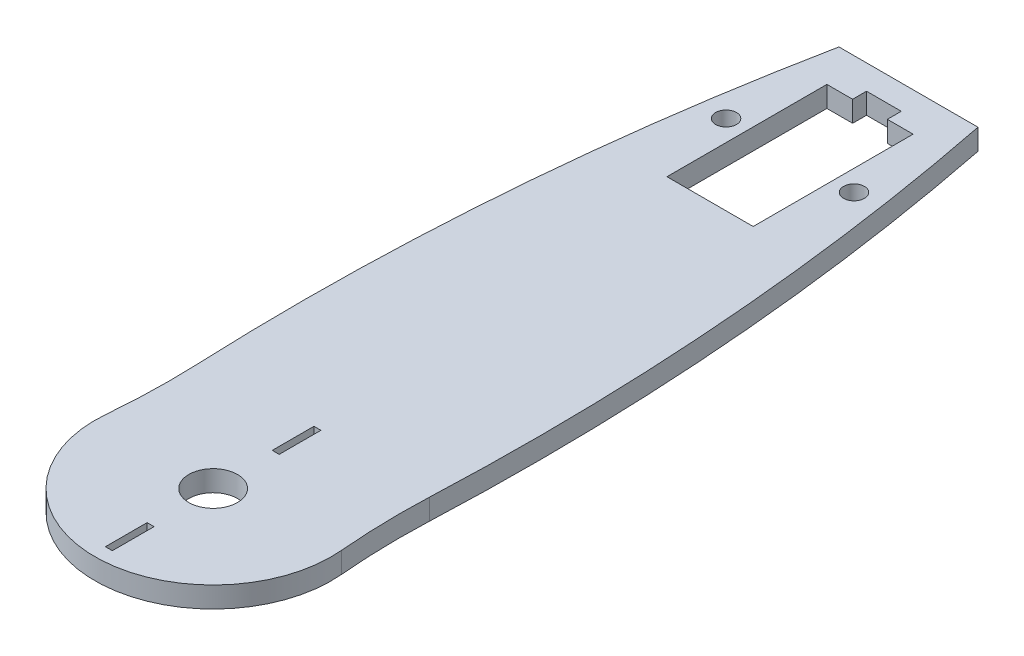
ISO-10303-21;
HEADER;
FILE_DESCRIPTION(('STEP AP214'),'2;1');
FILE_NAME('part.step','',(''),(''),'','','');
FILE_SCHEMA(('AUTOMOTIVE_DESIGN { 1 0 10303 214 1 1 1 1 }'));
ENDSEC;
DATA;
#1=APPLICATION_CONTEXT('core data for automotive mechanical design processes');
#2=APPLICATION_PROTOCOL_DEFINITION('international standard','automotive_design',2000,#1);
#3=PRODUCT_CONTEXT('',#1,'mechanical');
#4=PRODUCT('Part','Part','',(#3));
#5=PRODUCT_RELATED_PRODUCT_CATEGORY('part','',(#4));
#6=PRODUCT_DEFINITION_FORMATION('','',#4);
#7=PRODUCT_DEFINITION_CONTEXT('part definition',#1,'design');
#8=PRODUCT_DEFINITION('design','',#6,#7);
#9=PRODUCT_DEFINITION_SHAPE('','',#8);
#10=(LENGTH_UNIT() NAMED_UNIT(*) SI_UNIT(.MILLI.,.METRE.));
#11=(NAMED_UNIT(*) PLANE_ANGLE_UNIT() SI_UNIT($,.RADIAN.));
#12=(NAMED_UNIT(*) SI_UNIT($,.STERADIAN.) SOLID_ANGLE_UNIT());
#13=UNCERTAINTY_MEASURE_WITH_UNIT(LENGTH_MEASURE(1.E-05),#10,'distance_accuracy_value','');
#14=(GEOMETRIC_REPRESENTATION_CONTEXT(3) GLOBAL_UNCERTAINTY_ASSIGNED_CONTEXT((#13)) GLOBAL_UNIT_ASSIGNED_CONTEXT((#10,
#11,#12)) REPRESENTATION_CONTEXT('',''));
#15=CARTESIAN_POINT('',(0.,0.,0.));
#16=DIRECTION('',(0.,0.,1.));
#17=DIRECTION('',(1.,0.,0.));
#18=AXIS2_PLACEMENT_3D('',#15,#16,#17);
#19=CARTESIAN_POINT('',(-116.544221503631,3.,-10.3171911929821));
#20=DIRECTION('',(0.,1.,0.));
#21=DIRECTION('',(0.,0.,1.));
#22=AXIS2_PLACEMENT_3D('',#19,#20,#21);
#23=PLANE('',#22);
#24=CARTESIAN_POINT('',(9.20000000000008,3.,-82.9666133181393));
#25=DIRECTION('',(0.,1.,0.));
#26=DIRECTION('',(0.,0.,1.));
#27=AXIS2_PLACEMENT_3D('',#24,#25,#26);
#28=CIRCLE('',#27,1.5);
#29=CARTESIAN_POINT('',(9.20000000000008,3.,-81.4666133181393));
#30=VERTEX_POINT('',#29);
#31=EDGE_CURVE('E257',#30,#30,#28,.T.);
#32=ORIENTED_EDGE('',*,*,#31,.F.);
#33=EDGE_LOOP('',(#32));
#34=FACE_BOUND('',#33,.T.);
#35=CARTESIAN_POINT('',(-116.544221503631,3.,-10.3171911929821));
#36=DIRECTION('',(0.,-1.,0.));
#37=DIRECTION('',(0.,0.,1.));
#38=AXIS2_PLACEMENT_3D('',#35,#36,#37);
#39=CIRCLE('',#38,100.);
#40=CARTESIAN_POINT('',(-16.6322809003667,3.,-14.5129181728687));
#41=VERTEX_POINT('',#40);
#42=CARTESIAN_POINT('',(-16.9337757740319,3.,-1.49907906222818));
#43=VERTEX_POINT('',#42);
#44=EDGE_CURVE('E328',#41,#43,#39,.T.);
#45=ORIENTED_EDGE('',*,*,#44,.T.);
#46=CARTESIAN_POINT('',(0.,3.,0.));
#47=DIRECTION('',(0.,1.,0.));
#48=DIRECTION('',(0.,0.,1.));
#49=AXIS2_PLACEMENT_3D('',#46,#47,#48);
#50=CIRCLE('',#49,17.);
#51=CARTESIAN_POINT('',(16.9337757740319,3.,-1.49907906222817));
#52=VERTEX_POINT('',#51);
#53=EDGE_CURVE('E331',#43,#52,#50,.T.);
#54=ORIENTED_EDGE('',*,*,#53,.T.);
#55=CARTESIAN_POINT('',(116.544221503631,3.,-10.3171911929821));
#56=DIRECTION('',(0.,-1.,0.));
#57=DIRECTION('',(0.,0.,-1.));
#58=AXIS2_PLACEMENT_3D('',#55,#56,#57);
#59=CIRCLE('',#58,100.);
#60=CARTESIAN_POINT('',(16.6322809003667,3.,-14.5129181728686));
#61=VERTEX_POINT('',#60);
#62=EDGE_CURVE('E334',#52,#61,#59,.T.);
#63=ORIENTED_EDGE('',*,*,#62,.T.);
#64=CARTESIAN_POINT('',(-342.976936254119,3.,-29.6144374259302));
#65=DIRECTION('',(0.,1.,0.));
#66=DIRECTION('',(0.,0.,-1.));
#67=AXIS2_PLACEMENT_3D('',#64,#65,#66);
#68=CIRCLE('',#67,359.926165964927);
#69=CARTESIAN_POINT('',(9.99999999999995,3.,-100.));
#70=VERTEX_POINT('',#69);
#71=EDGE_CURVE('E336',#61,#70,#68,.T.);
#72=ORIENTED_EDGE('',*,*,#71,.T.);
#73=DIRECTION('',(-1.,0.,0.));
#74=VECTOR('',#73,1.);
#75=CARTESIAN_POINT('',(0.,3.,-100.));
#76=LINE('',#75,#74);
#77=CARTESIAN_POINT('',(-10.,3.,-100.));
#78=VERTEX_POINT('',#77);
#79=EDGE_CURVE('E338',#70,#78,#76,.T.);
#80=ORIENTED_EDGE('',*,*,#79,.T.);
#81=CARTESIAN_POINT('',(342.976936254119,3.,-29.6144374259302));
#82=DIRECTION('',(0.,1.,0.));
#83=DIRECTION('',(0.,0.,1.));
#84=AXIS2_PLACEMENT_3D('',#81,#82,#83);
#85=CIRCLE('',#84,359.926165964927);
#86=EDGE_CURVE('E340',#78,#41,#85,.T.);
#87=ORIENTED_EDGE('',*,*,#86,.T.);
#88=EDGE_LOOP('',(#45,#54,#63,#72,#80,#87));
#89=FACE_BOUND('',#88,.T.);
#90=CARTESIAN_POINT('',(0.,3.,0.));
#91=DIRECTION('',(0.,1.,0.));
#92=DIRECTION('',(0.,0.,1.));
#93=AXIS2_PLACEMENT_3D('',#90,#91,#92);
#94=CIRCLE('',#93,3.5);
#95=CARTESIAN_POINT('',(0.,3.,3.5));
#96=VERTEX_POINT('',#95);
#97=EDGE_CURVE('E322',#96,#96,#94,.T.);
#98=ORIENTED_EDGE('',*,*,#97,.F.);
#99=EDGE_LOOP('',(#98));
#100=FACE_BOUND('',#99,.T.);
#101=DIRECTION('',(0.,0.,-1.));
#102=VECTOR('',#101,1.);
#103=CARTESIAN_POINT('',(2.50000000000001,3.,-94.4666133181393));
#104=LINE('',#103,#102);
#105=CARTESIAN_POINT('',(2.50000000000001,3.,-94.4666133181393));
#106=VERTEX_POINT('',#105);
#107=CARTESIAN_POINT('',(2.50000000000001,3.,-96.4666133181393));
#108=VERTEX_POINT('',#107);
#109=EDGE_CURVE('E265',#106,#108,#104,.T.);
#110=ORIENTED_EDGE('',*,*,#109,.F.);
#111=DIRECTION('',(-1.,0.,0.));
#112=VECTOR('',#111,1.);
#113=CARTESIAN_POINT('',(6.20000000000002,3.,-94.4666133181393));
#114=LINE('',#113,#112);
#115=CARTESIAN_POINT('',(6.20000000000002,3.,-94.4666133181393));
#116=VERTEX_POINT('',#115);
#117=EDGE_CURVE('E263',#116,#106,#114,.T.);
#118=ORIENTED_EDGE('',*,*,#117,.F.);
#119=DIRECTION('',(0.,0.,-1.));
#120=VECTOR('',#119,1.);
#121=CARTESIAN_POINT('',(6.20000000000002,3.,-94.4666133181393));
#122=LINE('',#121,#120);
#123=CARTESIAN_POINT('',(6.20000000000003,3.,-71.4666133181393));
#124=VERTEX_POINT('',#123);
#125=EDGE_CURVE('E279',#124,#116,#122,.T.);
#126=ORIENTED_EDGE('',*,*,#125,.F.);
#127=DIRECTION('',(1.,0.,0.));
#128=VECTOR('',#127,1.);
#129=CARTESIAN_POINT('',(6.20000000000002,3.,-71.4666133181393));
#130=LINE('',#129,#128);
#131=CARTESIAN_POINT('',(-6.19999999999998,3.,-71.4666133181393));
#132=VERTEX_POINT('',#131);
#133=EDGE_CURVE('E276',#132,#124,#130,.T.);
#134=ORIENTED_EDGE('',*,*,#133,.F.);
#135=DIRECTION('',(0.,0.,1.));
#136=VECTOR('',#135,1.);
#137=CARTESIAN_POINT('',(-6.19999999999998,3.,-71.4666133181393));
#138=LINE('',#137,#136);
#139=CARTESIAN_POINT('',(-6.19999999999998,3.,-94.4666133181394));
#140=VERTEX_POINT('',#139);
#141=EDGE_CURVE('E274',#140,#132,#138,.T.);
#142=ORIENTED_EDGE('',*,*,#141,.F.);
#143=DIRECTION('',(-1.,0.,0.));
#144=VECTOR('',#143,1.);
#145=CARTESIAN_POINT('',(-6.19999999999998,3.,-94.4666133181394));
#146=LINE('',#145,#144);
#147=CARTESIAN_POINT('',(-2.50000000000001,3.,-94.4666133181394));
#148=VERTEX_POINT('',#147);
#149=EDGE_CURVE('E272',#148,#140,#146,.T.);
#150=ORIENTED_EDGE('',*,*,#149,.F.);
#151=DIRECTION('',(0.,0.,1.));
#152=VECTOR('',#151,1.);
#153=CARTESIAN_POINT('',(-2.50000000000001,3.,-96.4666133181393));
#154=LINE('',#153,#152);
#155=CARTESIAN_POINT('',(-2.50000000000001,3.,-96.4666133181393));
#156=VERTEX_POINT('',#155);
#157=EDGE_CURVE('E270',#156,#148,#154,.T.);
#158=ORIENTED_EDGE('',*,*,#157,.F.);
#159=DIRECTION('',(-1.,0.,0.));
#160=VECTOR('',#159,1.);
#161=CARTESIAN_POINT('',(2.50000000000001,3.,-96.4666133181393));
#162=LINE('',#161,#160);
#163=EDGE_CURVE('E268',#108,#156,#162,.T.);
#164=ORIENTED_EDGE('',*,*,#163,.F.);
#165=EDGE_LOOP('',(#110,#118,#126,#134,#142,#150,#158,#164));
#166=FACE_BOUND('',#165,.T.);
#167=CARTESIAN_POINT('',(-9.20000000000001,3.,-82.9666133181394));
#168=DIRECTION('',(0.,1.,0.));
#169=DIRECTION('',(0.,0.,-1.));
#170=AXIS2_PLACEMENT_3D('',#167,#168,#169);
#171=CIRCLE('',#170,1.5);
#172=CARTESIAN_POINT('',(-9.20000000000001,3.,-84.4666133181394));
#173=VERTEX_POINT('',#172);
#174=EDGE_CURVE('E251',#173,#173,#171,.T.);
#175=ORIENTED_EDGE('',*,*,#174,.F.);
#176=EDGE_LOOP('',(#175));
#177=FACE_BOUND('',#176,.T.);
#178=DIRECTION('',(0.,0.,1.));
#179=VECTOR('',#178,1.);
#180=CARTESIAN_POINT('',(-0.5,3.,15.));
#181=LINE('',#180,#179);
#182=CARTESIAN_POINT('',(-0.5,3.,9.));
#183=VERTEX_POINT('',#182);
#184=CARTESIAN_POINT('',(-0.5,3.,15.));
#185=VERTEX_POINT('',#184);
#186=EDGE_CURVE('E221',#183,#185,#181,.T.);
#187=ORIENTED_EDGE('',*,*,#186,.F.);
#188=DIRECTION('',(-1.,0.,0.));
#189=VECTOR('',#188,1.);
#190=CARTESIAN_POINT('',(-0.5,3.,9.));
#191=LINE('',#190,#189);
#192=CARTESIAN_POINT('',(0.5,3.,9.));
#193=VERTEX_POINT('',#192);
#194=EDGE_CURVE('E219',#193,#183,#191,.T.);
#195=ORIENTED_EDGE('',*,*,#194,.F.);
#196=DIRECTION('',(0.,0.,-1.));
#197=VECTOR('',#196,1.);
#198=CARTESIAN_POINT('',(0.5,3.,9.));
#199=LINE('',#198,#197);
#200=CARTESIAN_POINT('',(0.5,3.,15.));
#201=VERTEX_POINT('',#200);
#202=EDGE_CURVE('E227',#201,#193,#199,.T.);
#203=ORIENTED_EDGE('',*,*,#202,.F.);
#204=DIRECTION('',(1.,0.,0.));
#205=VECTOR('',#204,1.);
#206=CARTESIAN_POINT('',(0.,3.,15.));
#207=LINE('',#206,#205);
#208=EDGE_CURVE('E224',#185,#201,#207,.T.);
#209=ORIENTED_EDGE('',*,*,#208,.F.);
#210=EDGE_LOOP('',(#187,#195,#203,#209));
#211=FACE_BOUND('',#210,.T.);
#212=DIRECTION('',(-1.,0.,0.));
#213=VECTOR('',#212,1.);
#214=CARTESIAN_POINT('',(0.5,3.,-15.));
#215=LINE('',#214,#213);
#216=CARTESIAN_POINT('',(0.5,3.,-15.));
#217=VERTEX_POINT('',#216);
#218=CARTESIAN_POINT('',(-0.5,3.,-15.));
#219=VERTEX_POINT('',#218);
#220=EDGE_CURVE('E191',#217,#219,#215,.T.);
#221=ORIENTED_EDGE('',*,*,#220,.F.);
#222=DIRECTION('',(0.,0.,-1.));
#223=VECTOR('',#222,1.);
#224=CARTESIAN_POINT('',(0.5,3.,-9.));
#225=LINE('',#224,#223);
#226=CARTESIAN_POINT('',(0.5,3.,-9.));
#227=VERTEX_POINT('',#226);
#228=EDGE_CURVE('E183',#227,#217,#225,.T.);
#229=ORIENTED_EDGE('',*,*,#228,.F.);
#230=DIRECTION('',(1.,0.,0.));
#231=VECTOR('',#230,1.);
#232=CARTESIAN_POINT('',(-0.5,3.,-9.));
#233=LINE('',#232,#231);
#234=CARTESIAN_POINT('',(-0.5,3.,-9.));
#235=VERTEX_POINT('',#234);
#236=EDGE_CURVE('E205',#235,#227,#233,.T.);
#237=ORIENTED_EDGE('',*,*,#236,.F.);
#238=DIRECTION('',(0.,0.,1.));
#239=VECTOR('',#238,1.);
#240=CARTESIAN_POINT('',(-0.5,3.,-15.));
#241=LINE('',#240,#239);
#242=EDGE_CURVE('E203',#219,#235,#241,.T.);
#243=ORIENTED_EDGE('',*,*,#242,.F.);
#244=EDGE_LOOP('',(#221,#229,#237,#243));
#245=FACE_BOUND('',#244,.T.);
#246=ADVANCED_FACE('F34',(#34,#89,#100,#166,#177,#211,#245),#23,.T.);
#247=CARTESIAN_POINT('',(-116.544221503631,0.,-10.3171911929821));
#248=DIRECTION('',(0.,1.,0.));
#249=DIRECTION('',(0.,0.,1.));
#250=AXIS2_PLACEMENT_3D('',#247,#248,#249);
#251=PLANE('',#250);
#252=DIRECTION('',(-1.,0.,0.));
#253=VECTOR('',#252,1.);
#254=CARTESIAN_POINT('',(-0.5,0.,9.));
#255=LINE('',#254,#253);
#256=CARTESIAN_POINT('',(0.5,0.,9.));
#257=VERTEX_POINT('',#256);
#258=CARTESIAN_POINT('',(-0.5,0.,9.));
#259=VERTEX_POINT('',#258);
#260=EDGE_CURVE('E199',#257,#259,#255,.T.);
#261=ORIENTED_EDGE('',*,*,#260,.T.);
#262=DIRECTION('',(0.,0.,1.));
#263=VECTOR('',#262,1.);
#264=CARTESIAN_POINT('',(-0.5,0.,15.));
#265=LINE('',#264,#263);
#266=CARTESIAN_POINT('',(-0.5,0.,15.));
#267=VERTEX_POINT('',#266);
#268=EDGE_CURVE('E232',#259,#267,#265,.T.);
#269=ORIENTED_EDGE('',*,*,#268,.T.);
#270=DIRECTION('',(1.,0.,0.));
#271=VECTOR('',#270,1.);
#272=CARTESIAN_POINT('',(0.5,0.,15.));
#273=LINE('',#272,#271);
#274=CARTESIAN_POINT('',(0.5,0.,15.));
#275=VERTEX_POINT('',#274);
#276=EDGE_CURVE('E235',#267,#275,#273,.T.);
#277=ORIENTED_EDGE('',*,*,#276,.T.);
#278=DIRECTION('',(0.,0.,-1.));
#279=VECTOR('',#278,1.);
#280=CARTESIAN_POINT('',(0.5,0.,9.));
#281=LINE('',#280,#279);
#282=EDGE_CURVE('E222',#275,#257,#281,.T.);
#283=ORIENTED_EDGE('',*,*,#282,.T.);
#284=EDGE_LOOP('',(#261,#269,#277,#283));
#285=FACE_BOUND('',#284,.T.);
#286=CARTESIAN_POINT('',(0.,0.,0.));
#287=DIRECTION('',(0.,1.,0.));
#288=DIRECTION('',(0.,0.,1.));
#289=AXIS2_PLACEMENT_3D('',#286,#287,#288);
#290=CIRCLE('',#289,3.5);
#291=CARTESIAN_POINT('',(0.,0.,3.5));
#292=VERTEX_POINT('',#291);
#293=EDGE_CURVE('E321',#292,#292,#290,.T.);
#294=ORIENTED_EDGE('',*,*,#293,.T.);
#295=EDGE_LOOP('',(#294));
#296=FACE_BOUND('',#295,.T.);
#297=CARTESIAN_POINT('',(-116.544221503631,0.,-10.3171911929821));
#298=DIRECTION('',(0.,-1.,0.));
#299=DIRECTION('',(0.,0.,1.));
#300=AXIS2_PLACEMENT_3D('',#297,#298,#299);
#301=CIRCLE('',#300,100.);
#302=CARTESIAN_POINT('',(-16.6322809003667,0.,-14.5129181728687));
#303=VERTEX_POINT('',#302);
#304=CARTESIAN_POINT('',(-16.9337757740319,0.,-1.49907906222818));
#305=VERTEX_POINT('',#304);
#306=EDGE_CURVE('E325',#303,#305,#301,.T.);
#307=ORIENTED_EDGE('',*,*,#306,.F.);
#308=CARTESIAN_POINT('',(342.976936254119,0.,-29.6144374259302));
#309=DIRECTION('',(0.,1.,0.));
#310=DIRECTION('',(0.,0.,1.));
#311=AXIS2_PLACEMENT_3D('',#308,#309,#310);
#312=CIRCLE('',#311,359.926165964927);
#313=CARTESIAN_POINT('',(-10.,0.,-100.));
#314=VERTEX_POINT('',#313);
#315=EDGE_CURVE('E332',#314,#303,#312,.T.);
#316=ORIENTED_EDGE('',*,*,#315,.F.);
#317=DIRECTION('',(-1.,0.,0.));
#318=VECTOR('',#317,1.);
#319=CARTESIAN_POINT('',(0.,0.,-100.));
#320=LINE('',#319,#318);
#321=CARTESIAN_POINT('',(9.99999999999995,0.,-100.));
#322=VERTEX_POINT('',#321);
#323=EDGE_CURVE('E352',#322,#314,#320,.T.);
#324=ORIENTED_EDGE('',*,*,#323,.F.);
#325=CARTESIAN_POINT('',(-342.976936254119,0.,-29.6144374259302));
#326=DIRECTION('',(0.,1.,0.));
#327=DIRECTION('',(0.,0.,-1.));
#328=AXIS2_PLACEMENT_3D('',#325,#326,#327);
#329=CIRCLE('',#328,359.926165964927);
#330=CARTESIAN_POINT('',(16.6322809003667,0.,-14.5129181728686));
#331=VERTEX_POINT('',#330);
#332=EDGE_CURVE('E349',#331,#322,#329,.T.);
#333=ORIENTED_EDGE('',*,*,#332,.F.);
#334=CARTESIAN_POINT('',(116.544221503631,0.,-10.3171911929821));
#335=DIRECTION('',(0.,-1.,0.));
#336=DIRECTION('',(0.,0.,-1.));
#337=AXIS2_PLACEMENT_3D('',#334,#335,#336);
#338=CIRCLE('',#337,100.);
#339=CARTESIAN_POINT('',(16.9337757740319,0.,-1.49907906222817));
#340=VERTEX_POINT('',#339);
#341=EDGE_CURVE('E347',#340,#331,#338,.T.);
#342=ORIENTED_EDGE('',*,*,#341,.F.);
#343=CARTESIAN_POINT('',(0.,0.,0.));
#344=DIRECTION('',(0.,1.,0.));
#345=DIRECTION('',(0.,0.,1.));
#346=AXIS2_PLACEMENT_3D('',#343,#344,#345);
#347=CIRCLE('',#346,17.);
#348=EDGE_CURVE('E345',#305,#340,#347,.T.);
#349=ORIENTED_EDGE('',*,*,#348,.F.);
#350=EDGE_LOOP('',(#307,#316,#324,#333,#342,#349));
#351=FACE_BOUND('',#350,.T.);
#352=DIRECTION('',(-1.,0.,0.));
#353=VECTOR('',#352,1.);
#354=CARTESIAN_POINT('',(6.20000000000002,0.,-94.4666133181393));
#355=LINE('',#354,#353);
#356=CARTESIAN_POINT('',(6.20000000000003,0.,-94.4666133181393));
#357=VERTEX_POINT('',#356);
#358=CARTESIAN_POINT('',(2.50000000000001,0.,-94.4666133181393));
#359=VERTEX_POINT('',#358);
#360=EDGE_CURVE('E260',#357,#359,#355,.T.);
#361=ORIENTED_EDGE('',*,*,#360,.T.);
#362=DIRECTION('',(0.,0.,-1.));
#363=VECTOR('',#362,1.);
#364=CARTESIAN_POINT('',(2.50000000000001,0.,-94.4666133181393));
#365=LINE('',#364,#363);
#366=CARTESIAN_POINT('',(2.50000000000001,0.,-96.4666133181393));
#367=VERTEX_POINT('',#366);
#368=EDGE_CURVE('E284',#359,#367,#365,.T.);
#369=ORIENTED_EDGE('',*,*,#368,.T.);
#370=DIRECTION('',(-1.,0.,0.));
#371=VECTOR('',#370,1.);
#372=CARTESIAN_POINT('',(2.50000000000001,0.,-96.4666133181393));
#373=LINE('',#372,#371);
#374=CARTESIAN_POINT('',(-2.50000000000001,0.,-96.4666133181393));
#375=VERTEX_POINT('',#374);
#376=EDGE_CURVE('E287',#367,#375,#373,.T.);
#377=ORIENTED_EDGE('',*,*,#376,.T.);
#378=DIRECTION('',(0.,0.,1.));
#379=VECTOR('',#378,1.);
#380=CARTESIAN_POINT('',(-2.50000000000001,0.,-96.4666133181393));
#381=LINE('',#380,#379);
#382=CARTESIAN_POINT('',(-2.50000000000001,0.,-94.4666133181394));
#383=VERTEX_POINT('',#382);
#384=EDGE_CURVE('E290',#375,#383,#381,.T.);
#385=ORIENTED_EDGE('',*,*,#384,.T.);
#386=DIRECTION('',(-1.,0.,0.));
#387=VECTOR('',#386,1.);
#388=CARTESIAN_POINT('',(-6.19999999999998,0.,-94.4666133181394));
#389=LINE('',#388,#387);
#390=CARTESIAN_POINT('',(-6.19999999999998,0.,-94.4666133181394));
#391=VERTEX_POINT('',#390);
#392=EDGE_CURVE('E293',#383,#391,#389,.T.);
#393=ORIENTED_EDGE('',*,*,#392,.T.);
#394=DIRECTION('',(0.,0.,1.));
#395=VECTOR('',#394,1.);
#396=CARTESIAN_POINT('',(-6.19999999999998,0.,-71.4666133181393));
#397=LINE('',#396,#395);
#398=CARTESIAN_POINT('',(-6.19999999999998,0.,-71.4666133181393));
#399=VERTEX_POINT('',#398);
#400=EDGE_CURVE('E296',#391,#399,#397,.T.);
#401=ORIENTED_EDGE('',*,*,#400,.T.);
#402=DIRECTION('',(1.,0.,0.));
#403=VECTOR('',#402,1.);
#404=CARTESIAN_POINT('',(6.20000000000002,0.,-71.4666133181393));
#405=LINE('',#404,#403);
#406=CARTESIAN_POINT('',(6.20000000000002,0.,-71.4666133181393));
#407=VERTEX_POINT('',#406);
#408=EDGE_CURVE('E299',#399,#407,#405,.T.);
#409=ORIENTED_EDGE('',*,*,#408,.T.);
#410=DIRECTION('',(0.,0.,-1.));
#411=VECTOR('',#410,1.);
#412=CARTESIAN_POINT('',(6.20000000000002,0.,-94.4666133181393));
#413=LINE('',#412,#411);
#414=EDGE_CURVE('E266',#407,#357,#413,.T.);
#415=ORIENTED_EDGE('',*,*,#414,.T.);
#416=EDGE_LOOP('',(#361,#369,#377,#385,#393,#401,#409,#415));
#417=FACE_BOUND('',#416,.T.);
#418=CARTESIAN_POINT('',(9.20000000000008,0.,-82.9666133181393));
#419=DIRECTION('',(0.,1.,0.));
#420=DIRECTION('',(0.,0.,1.));
#421=AXIS2_PLACEMENT_3D('',#418,#419,#420);
#422=CIRCLE('',#421,1.5);
#423=CARTESIAN_POINT('',(9.20000000000008,0.,-81.4666133181393));
#424=VERTEX_POINT('',#423);
#425=EDGE_CURVE('E254',#424,#424,#422,.T.);
#426=ORIENTED_EDGE('',*,*,#425,.T.);
#427=EDGE_LOOP('',(#426));
#428=FACE_BOUND('',#427,.T.);
#429=CARTESIAN_POINT('',(-9.20000000000001,0.,-82.9666133181394));
#430=DIRECTION('',(0.,1.,0.));
#431=DIRECTION('',(0.,0.,-1.));
#432=AXIS2_PLACEMENT_3D('',#429,#430,#431);
#433=CIRCLE('',#432,1.5);
#434=CARTESIAN_POINT('',(-9.20000000000001,0.,-84.4666133181394));
#435=VERTEX_POINT('',#434);
#436=EDGE_CURVE('E250',#435,#435,#433,.T.);
#437=ORIENTED_EDGE('',*,*,#436,.T.);
#438=EDGE_LOOP('',(#437));
#439=FACE_BOUND('',#438,.T.);
#440=DIRECTION('',(0.,0.,-1.));
#441=VECTOR('',#440,1.);
#442=CARTESIAN_POINT('',(0.5,0.,-9.));
#443=LINE('',#442,#441);
#444=CARTESIAN_POINT('',(0.5,0.,-9.));
#445=VERTEX_POINT('',#444);
#446=CARTESIAN_POINT('',(0.5,0.,-15.));
#447=VERTEX_POINT('',#446);
#448=EDGE_CURVE('E57',#445,#447,#443,.T.);
#449=ORIENTED_EDGE('',*,*,#448,.T.);
#450=DIRECTION('',(-1.,0.,0.));
#451=VECTOR('',#450,1.);
#452=CARTESIAN_POINT('',(0.,0.,-15.));
#453=LINE('',#452,#451);
#454=CARTESIAN_POINT('',(-0.5,0.,-15.));
#455=VERTEX_POINT('',#454);
#456=EDGE_CURVE('E198',#447,#455,#453,.T.);
#457=ORIENTED_EDGE('',*,*,#456,.T.);
#458=DIRECTION('',(0.,0.,1.));
#459=VECTOR('',#458,1.);
#460=CARTESIAN_POINT('',(-0.5,0.,-15.));
#461=LINE('',#460,#459);
#462=CARTESIAN_POINT('',(-0.5,0.,-9.));
#463=VERTEX_POINT('',#462);
#464=EDGE_CURVE('E211',#455,#463,#461,.T.);
#465=ORIENTED_EDGE('',*,*,#464,.T.);
#466=DIRECTION('',(1.,0.,0.));
#467=VECTOR('',#466,1.);
#468=CARTESIAN_POINT('',(-0.5,0.,-9.));
#469=LINE('',#468,#467);
#470=EDGE_CURVE('E192',#463,#445,#469,.T.);
#471=ORIENTED_EDGE('',*,*,#470,.T.);
#472=EDGE_LOOP('',(#449,#457,#465,#471));
#473=FACE_BOUND('',#472,.T.);
#474=ADVANCED_FACE('F376',(#285,#296,#351,#417,#428,#439,#473),#251,.F.);
#475=CARTESIAN_POINT('',(-116.544221503631,3.,-10.3171911929821));
#476=DIRECTION('',(0.,-1.,0.));
#477=DIRECTION('',(0.,0.,-1.));
#478=AXIS2_PLACEMENT_3D('',#475,#476,#477);
#479=CYLINDRICAL_SURFACE('',#478,100.);
#480=ORIENTED_EDGE('',*,*,#306,.T.);
#481=DIRECTION('',(0.,-1.,0.));
#482=VECTOR('',#481,1.);
#483=CARTESIAN_POINT('',(-16.9337757740319,3.,-1.49907906222818));
#484=LINE('',#483,#482);
#485=EDGE_CURVE('E11',#43,#305,#484,.T.);
#486=ORIENTED_EDGE('',*,*,#485,.F.);
#487=ORIENTED_EDGE('',*,*,#44,.F.);
#488=DIRECTION('',(0.,-1.,0.));
#489=VECTOR('',#488,1.);
#490=CARTESIAN_POINT('',(-16.6322809003667,3.,-14.5129181728687));
#491=LINE('',#490,#489);
#492=EDGE_CURVE('E342',#41,#303,#491,.T.);
#493=ORIENTED_EDGE('',*,*,#492,.T.);
#494=EDGE_LOOP('',(#480,#486,#487,#493));
#495=FACE_BOUND('',#494,.T.);
#496=ADVANCED_FACE('F36',(#495),#479,.F.);
#497=CARTESIAN_POINT('',(0.,3.,0.));
#498=DIRECTION('',(0.,-1.,0.));
#499=DIRECTION('',(0.,0.,-1.));
#500=AXIS2_PLACEMENT_3D('',#497,#498,#499);
#501=CYLINDRICAL_SURFACE('',#500,17.);
#502=ORIENTED_EDGE('',*,*,#348,.T.);
#503=DIRECTION('',(0.,-1.,0.));
#504=VECTOR('',#503,1.);
#505=CARTESIAN_POINT('',(16.9337757740319,3.,-1.49907906222817));
#506=LINE('',#505,#504);
#507=EDGE_CURVE('E42',#52,#340,#506,.T.);
#508=ORIENTED_EDGE('',*,*,#507,.F.);
#509=ORIENTED_EDGE('',*,*,#53,.F.);
#510=ORIENTED_EDGE('',*,*,#485,.T.);
#511=EDGE_LOOP('',(#502,#508,#509,#510));
#512=FACE_BOUND('',#511,.T.);
#513=ADVANCED_FACE('F393',(#512),#501,.T.);
#514=CARTESIAN_POINT('',(116.544221503631,3.,-10.3171911929821));
#515=DIRECTION('',(0.,-1.,0.));
#516=DIRECTION('',(0.,0.,-1.));
#517=AXIS2_PLACEMENT_3D('',#514,#515,#516);
#518=CYLINDRICAL_SURFACE('',#517,100.);
#519=ORIENTED_EDGE('',*,*,#341,.T.);
#520=DIRECTION('',(0.,-1.,0.));
#521=VECTOR('',#520,1.);
#522=CARTESIAN_POINT('',(16.6322809003667,3.,-14.5129181728686));
#523=LINE('',#522,#521);
#524=EDGE_CURVE('E363',#61,#331,#523,.T.);
#525=ORIENTED_EDGE('',*,*,#524,.F.);
#526=ORIENTED_EDGE('',*,*,#62,.F.);
#527=ORIENTED_EDGE('',*,*,#507,.T.);
#528=EDGE_LOOP('',(#519,#525,#526,#527));
#529=FACE_BOUND('',#528,.T.);
#530=ADVANCED_FACE('F370',(#529),#518,.F.);
#531=CARTESIAN_POINT('',(-342.976936254119,3.,-29.6144374259302));
#532=DIRECTION('',(0.,-1.,0.));
#533=DIRECTION('',(0.,0.,-1.));
#534=AXIS2_PLACEMENT_3D('',#531,#532,#533);
#535=CYLINDRICAL_SURFACE('',#534,359.926165964927);
#536=ORIENTED_EDGE('',*,*,#332,.T.);
#537=DIRECTION('',(0.,-1.,0.));
#538=VECTOR('',#537,1.);
#539=CARTESIAN_POINT('',(9.99999999999995,3.,-100.));
#540=LINE('',#539,#538);
#541=EDGE_CURVE('E360',#70,#322,#540,.T.);
#542=ORIENTED_EDGE('',*,*,#541,.F.);
#543=ORIENTED_EDGE('',*,*,#71,.F.);
#544=ORIENTED_EDGE('',*,*,#524,.T.);
#545=EDGE_LOOP('',(#536,#542,#543,#544));
#546=FACE_BOUND('',#545,.T.);
#547=ADVANCED_FACE('F381',(#546),#535,.T.);
#548=CARTESIAN_POINT('',(0.,3.,-100.));
#549=DIRECTION('',(0.,0.,1.));
#550=DIRECTION('',(1.,0.,0.));
#551=AXIS2_PLACEMENT_3D('',#548,#549,#550);
#552=PLANE('',#551);
#553=ORIENTED_EDGE('',*,*,#323,.T.);
#554=DIRECTION('',(0.,-1.,0.));
#555=VECTOR('',#554,1.);
#556=CARTESIAN_POINT('',(-10.,3.,-100.));
#557=LINE('',#556,#555);
#558=EDGE_CURVE('E357',#78,#314,#557,.T.);
#559=ORIENTED_EDGE('',*,*,#558,.F.);
#560=ORIENTED_EDGE('',*,*,#79,.F.);
#561=ORIENTED_EDGE('',*,*,#541,.T.);
#562=EDGE_LOOP('',(#553,#559,#560,#561));
#563=FACE_BOUND('',#562,.T.);
#564=ADVANCED_FACE('F385',(#563),#552,.F.);
#565=CARTESIAN_POINT('',(342.976936254119,3.,-29.6144374259302));
#566=DIRECTION('',(0.,-1.,0.));
#567=DIRECTION('',(0.,0.,-1.));
#568=AXIS2_PLACEMENT_3D('',#565,#566,#567);
#569=CYLINDRICAL_SURFACE('',#568,359.926165964927);
#570=ORIENTED_EDGE('',*,*,#315,.T.);
#571=ORIENTED_EDGE('',*,*,#492,.F.);
#572=ORIENTED_EDGE('',*,*,#86,.F.);
#573=ORIENTED_EDGE('',*,*,#558,.T.);
#574=EDGE_LOOP('',(#570,#571,#572,#573));
#575=FACE_BOUND('',#574,.T.);
#576=ADVANCED_FACE('F396',(#575),#569,.T.);
#577=CARTESIAN_POINT('',(0.,3.,0.));
#578=DIRECTION('',(0.,-1.,0.));
#579=DIRECTION('',(0.,0.,-1.));
#580=AXIS2_PLACEMENT_3D('',#577,#578,#579);
#581=CYLINDRICAL_SURFACE('',#580,3.5);
#582=ORIENTED_EDGE('',*,*,#97,.T.);
#583=EDGE_LOOP('',(#582));
#584=FACE_BOUND('',#583,.T.);
#585=ORIENTED_EDGE('',*,*,#293,.F.);
#586=EDGE_LOOP('',(#585));
#587=FACE_BOUND('',#586,.T.);
#588=ADVANCED_FACE('F398',(#584,#587),#581,.F.);
#589=CARTESIAN_POINT('',(6.20000000000002,3.,-94.4666133181393));
#590=DIRECTION('',(0.,0.,1.));
#591=DIRECTION('',(1.,0.,0.));
#592=AXIS2_PLACEMENT_3D('',#589,#590,#591);
#593=PLANE('',#592);
#594=ORIENTED_EDGE('',*,*,#360,.F.);
#595=DIRECTION('',(0.,-1.,0.));
#596=VECTOR('',#595,1.);
#597=CARTESIAN_POINT('',(6.20000000000002,3.,-94.4666133181393));
#598=LINE('',#597,#596);
#599=EDGE_CURVE('E281',#116,#357,#598,.T.);
#600=ORIENTED_EDGE('',*,*,#599,.F.);
#601=ORIENTED_EDGE('',*,*,#117,.T.);
#602=DIRECTION('',(0.,-1.,0.));
#603=VECTOR('',#602,1.);
#604=CARTESIAN_POINT('',(2.50000000000001,3.,-94.4666133181393));
#605=LINE('',#604,#603);
#606=EDGE_CURVE('E318',#106,#359,#605,.T.);
#607=ORIENTED_EDGE('',*,*,#606,.T.);
#608=EDGE_LOOP('',(#594,#600,#601,#607));
#609=FACE_BOUND('',#608,.T.);
#610=ADVANCED_FACE('F404',(#609),#593,.T.);
#611=CARTESIAN_POINT('',(2.50000000000001,3.,-94.4666133181393));
#612=DIRECTION('',(-1.,0.,0.));
#613=DIRECTION('',(0.,0.,1.));
#614=AXIS2_PLACEMENT_3D('',#611,#612,#613);
#615=PLANE('',#614);
#616=ORIENTED_EDGE('',*,*,#368,.F.);
#617=ORIENTED_EDGE('',*,*,#606,.F.);
#618=ORIENTED_EDGE('',*,*,#109,.T.);
#619=DIRECTION('',(0.,-1.,0.));
#620=VECTOR('',#619,1.);
#621=CARTESIAN_POINT('',(2.50000000000001,3.,-96.4666133181393));
#622=LINE('',#621,#620);
#623=EDGE_CURVE('E316',#108,#367,#622,.T.);
#624=ORIENTED_EDGE('',*,*,#623,.T.);
#625=EDGE_LOOP('',(#616,#617,#618,#624));
#626=FACE_BOUND('',#625,.T.);
#627=ADVANCED_FACE('F420',(#626),#615,.T.);
#628=CARTESIAN_POINT('',(2.50000000000001,3.,-96.4666133181393));
#629=DIRECTION('',(0.,0.,1.));
#630=DIRECTION('',(1.,0.,0.));
#631=AXIS2_PLACEMENT_3D('',#628,#629,#630);
#632=PLANE('',#631);
#633=ORIENTED_EDGE('',*,*,#376,.F.);
#634=ORIENTED_EDGE('',*,*,#623,.F.);
#635=ORIENTED_EDGE('',*,*,#163,.T.);
#636=DIRECTION('',(0.,-1.,0.));
#637=VECTOR('',#636,1.);
#638=CARTESIAN_POINT('',(-2.50000000000001,3.,-96.4666133181393));
#639=LINE('',#638,#637);
#640=EDGE_CURVE('E314',#156,#375,#639,.T.);
#641=ORIENTED_EDGE('',*,*,#640,.T.);
#642=EDGE_LOOP('',(#633,#634,#635,#641));
#643=FACE_BOUND('',#642,.T.);
#644=ADVANCED_FACE('F424',(#643),#632,.T.);
#645=CARTESIAN_POINT('',(-2.50000000000001,3.,-96.4666133181393));
#646=DIRECTION('',(1.,0.,0.));
#647=DIRECTION('',(0.,0.,-1.));
#648=AXIS2_PLACEMENT_3D('',#645,#646,#647);
#649=PLANE('',#648);
#650=ORIENTED_EDGE('',*,*,#384,.F.);
#651=ORIENTED_EDGE('',*,*,#640,.F.);
#652=ORIENTED_EDGE('',*,*,#157,.T.);
#653=DIRECTION('',(0.,-1.,0.));
#654=VECTOR('',#653,1.);
#655=CARTESIAN_POINT('',(-2.50000000000001,3.,-94.4666133181394));
#656=LINE('',#655,#654);
#657=EDGE_CURVE('E312',#148,#383,#656,.T.);
#658=ORIENTED_EDGE('',*,*,#657,.T.);
#659=EDGE_LOOP('',(#650,#651,#652,#658));
#660=FACE_BOUND('',#659,.T.);
#661=ADVANCED_FACE('F428',(#660),#649,.T.);
#662=CARTESIAN_POINT('',(-6.19999999999998,3.,-94.4666133181394));
#663=DIRECTION('',(0.,0.,1.));
#664=DIRECTION('',(1.,0.,0.));
#665=AXIS2_PLACEMENT_3D('',#662,#663,#664);
#666=PLANE('',#665);
#667=ORIENTED_EDGE('',*,*,#392,.F.);
#668=ORIENTED_EDGE('',*,*,#657,.F.);
#669=ORIENTED_EDGE('',*,*,#149,.T.);
#670=DIRECTION('',(0.,-1.,0.));
#671=VECTOR('',#670,1.);
#672=CARTESIAN_POINT('',(-6.19999999999998,3.,-94.4666133181394));
#673=LINE('',#672,#671);
#674=EDGE_CURVE('E310',#140,#391,#673,.T.);
#675=ORIENTED_EDGE('',*,*,#674,.T.);
#676=EDGE_LOOP('',(#667,#668,#669,#675));
#677=FACE_BOUND('',#676,.T.);
#678=ADVANCED_FACE('F432',(#677),#666,.T.);
#679=CARTESIAN_POINT('',(-6.19999999999998,3.,-71.4666133181393));
#680=DIRECTION('',(1.,0.,0.));
#681=DIRECTION('',(0.,0.,-1.));
#682=AXIS2_PLACEMENT_3D('',#679,#680,#681);
#683=PLANE('',#682);
#684=ORIENTED_EDGE('',*,*,#400,.F.);
#685=ORIENTED_EDGE('',*,*,#674,.F.);
#686=ORIENTED_EDGE('',*,*,#141,.T.);
#687=DIRECTION('',(0.,-1.,0.));
#688=VECTOR('',#687,1.);
#689=CARTESIAN_POINT('',(-6.19999999999998,3.,-71.4666133181393));
#690=LINE('',#689,#688);
#691=EDGE_CURVE('E308',#132,#399,#690,.T.);
#692=ORIENTED_EDGE('',*,*,#691,.T.);
#693=EDGE_LOOP('',(#684,#685,#686,#692));
#694=FACE_BOUND('',#693,.T.);
#695=ADVANCED_FACE('F436',(#694),#683,.T.);
#696=CARTESIAN_POINT('',(6.20000000000002,3.,-71.4666133181393));
#697=DIRECTION('',(0.,0.,-1.));
#698=DIRECTION('',(-1.,0.,0.));
#699=AXIS2_PLACEMENT_3D('',#696,#697,#698);
#700=PLANE('',#699);
#701=ORIENTED_EDGE('',*,*,#408,.F.);
#702=ORIENTED_EDGE('',*,*,#691,.F.);
#703=ORIENTED_EDGE('',*,*,#133,.T.);
#704=DIRECTION('',(0.,-1.,0.));
#705=VECTOR('',#704,1.);
#706=CARTESIAN_POINT('',(6.20000000000002,3.,-71.4666133181393));
#707=LINE('',#706,#705);
#708=EDGE_CURVE('E306',#124,#407,#707,.T.);
#709=ORIENTED_EDGE('',*,*,#708,.T.);
#710=EDGE_LOOP('',(#701,#702,#703,#709));
#711=FACE_BOUND('',#710,.T.);
#712=ADVANCED_FACE('F440',(#711),#700,.T.);
#713=CARTESIAN_POINT('',(6.20000000000002,3.,-94.4666133181393));
#714=DIRECTION('',(-1.,0.,0.));
#715=DIRECTION('',(0.,0.,1.));
#716=AXIS2_PLACEMENT_3D('',#713,#714,#715);
#717=PLANE('',#716);
#718=ORIENTED_EDGE('',*,*,#414,.F.);
#719=ORIENTED_EDGE('',*,*,#708,.F.);
#720=ORIENTED_EDGE('',*,*,#125,.T.);
#721=ORIENTED_EDGE('',*,*,#599,.T.);
#722=EDGE_LOOP('',(#718,#719,#720,#721));
#723=FACE_BOUND('',#722,.T.);
#724=ADVANCED_FACE('F444',(#723),#717,.T.);
#725=CARTESIAN_POINT('',(9.20000000000008,3.,-82.9666133181393));
#726=DIRECTION('',(0.,-1.,0.));
#727=DIRECTION('',(0.,0.,-1.));
#728=AXIS2_PLACEMENT_3D('',#725,#726,#727);
#729=CYLINDRICAL_SURFACE('',#728,1.5);
#730=ORIENTED_EDGE('',*,*,#31,.T.);
#731=EDGE_LOOP('',(#730));
#732=FACE_BOUND('',#731,.T.);
#733=ORIENTED_EDGE('',*,*,#425,.F.);
#734=EDGE_LOOP('',(#733));
#735=FACE_BOUND('',#734,.T.);
#736=ADVANCED_FACE('F448',(#732,#735),#729,.F.);
#737=CARTESIAN_POINT('',(-9.20000000000001,3.,-82.9666133181394));
#738=DIRECTION('',(0.,-1.,0.));
#739=DIRECTION('',(0.,0.,-1.));
#740=AXIS2_PLACEMENT_3D('',#737,#738,#739);
#741=CYLINDRICAL_SURFACE('',#740,1.5);
#742=ORIENTED_EDGE('',*,*,#174,.T.);
#743=EDGE_LOOP('',(#742));
#744=FACE_BOUND('',#743,.T.);
#745=ORIENTED_EDGE('',*,*,#436,.F.);
#746=EDGE_LOOP('',(#745));
#747=FACE_BOUND('',#746,.T.);
#748=ADVANCED_FACE('F452',(#744,#747),#741,.F.);
#749=CARTESIAN_POINT('',(-0.5,3.,9.));
#750=DIRECTION('',(0.,0.,1.));
#751=DIRECTION('',(1.,0.,0.));
#752=AXIS2_PLACEMENT_3D('',#749,#750,#751);
#753=PLANE('',#752);
#754=ORIENTED_EDGE('',*,*,#260,.F.);
#755=DIRECTION('',(0.,-1.,0.));
#756=VECTOR('',#755,1.);
#757=CARTESIAN_POINT('',(0.5,3.,9.));
#758=LINE('',#757,#756);
#759=EDGE_CURVE('E229',#193,#257,#758,.T.);
#760=ORIENTED_EDGE('',*,*,#759,.F.);
#761=ORIENTED_EDGE('',*,*,#194,.T.);
#762=DIRECTION('',(0.,-1.,0.));
#763=VECTOR('',#762,1.);
#764=CARTESIAN_POINT('',(-0.5,3.,9.));
#765=LINE('',#764,#763);
#766=EDGE_CURVE('E247',#183,#259,#765,.T.);
#767=ORIENTED_EDGE('',*,*,#766,.T.);
#768=EDGE_LOOP('',(#754,#760,#761,#767));
#769=FACE_BOUND('',#768,.T.);
#770=ADVANCED_FACE('F456',(#769),#753,.T.);
#771=CARTESIAN_POINT('',(-0.5,3.,15.));
#772=DIRECTION('',(1.,0.,0.));
#773=DIRECTION('',(0.,0.,-1.));
#774=AXIS2_PLACEMENT_3D('',#771,#772,#773);
#775=PLANE('',#774);
#776=ORIENTED_EDGE('',*,*,#268,.F.);
#777=ORIENTED_EDGE('',*,*,#766,.F.);
#778=ORIENTED_EDGE('',*,*,#186,.T.);
#779=DIRECTION('',(0.,-1.,0.));
#780=VECTOR('',#779,1.);
#781=CARTESIAN_POINT('',(-0.5,3.,15.));
#782=LINE('',#781,#780);
#783=EDGE_CURVE('E244',#185,#267,#782,.T.);
#784=ORIENTED_EDGE('',*,*,#783,.T.);
#785=EDGE_LOOP('',(#776,#777,#778,#784));
#786=FACE_BOUND('',#785,.T.);
#787=ADVANCED_FACE('F460',(#786),#775,.T.);
#788=CARTESIAN_POINT('',(0.5,3.,15.));
#789=DIRECTION('',(0.,0.,-1.));
#790=DIRECTION('',(-1.,0.,0.));
#791=AXIS2_PLACEMENT_3D('',#788,#789,#790);
#792=PLANE('',#791);
#793=ORIENTED_EDGE('',*,*,#276,.F.);
#794=ORIENTED_EDGE('',*,*,#783,.F.);
#795=ORIENTED_EDGE('',*,*,#208,.T.);
#796=DIRECTION('',(0.,-1.,0.));
#797=VECTOR('',#796,1.);
#798=CARTESIAN_POINT('',(0.5,3.,15.));
#799=LINE('',#798,#797);
#800=EDGE_CURVE('E242',#201,#275,#799,.T.);
#801=ORIENTED_EDGE('',*,*,#800,.T.);
#802=EDGE_LOOP('',(#793,#794,#795,#801));
#803=FACE_BOUND('',#802,.T.);
#804=ADVANCED_FACE('F464',(#803),#792,.T.);
#805=CARTESIAN_POINT('',(0.5,3.,9.));
#806=DIRECTION('',(-1.,0.,0.));
#807=DIRECTION('',(0.,0.,1.));
#808=AXIS2_PLACEMENT_3D('',#805,#806,#807);
#809=PLANE('',#808);
#810=ORIENTED_EDGE('',*,*,#282,.F.);
#811=ORIENTED_EDGE('',*,*,#800,.F.);
#812=ORIENTED_EDGE('',*,*,#202,.T.);
#813=ORIENTED_EDGE('',*,*,#759,.T.);
#814=EDGE_LOOP('',(#810,#811,#812,#813));
#815=FACE_BOUND('',#814,.T.);
#816=ADVANCED_FACE('F468',(#815),#809,.T.);
#817=CARTESIAN_POINT('',(0.5,3.,-9.));
#818=DIRECTION('',(-1.,0.,0.));
#819=DIRECTION('',(0.,0.,1.));
#820=AXIS2_PLACEMENT_3D('',#817,#818,#819);
#821=PLANE('',#820);
#822=ORIENTED_EDGE('',*,*,#448,.F.);
#823=DIRECTION('',(0.,-1.,0.));
#824=VECTOR('',#823,1.);
#825=CARTESIAN_POINT('',(0.5,3.,-9.));
#826=LINE('',#825,#824);
#827=EDGE_CURVE('E187',#227,#445,#826,.T.);
#828=ORIENTED_EDGE('',*,*,#827,.F.);
#829=ORIENTED_EDGE('',*,*,#228,.T.);
#830=DIRECTION('',(0.,-1.,0.));
#831=VECTOR('',#830,1.);
#832=CARTESIAN_POINT('',(0.5,3.,-15.));
#833=LINE('',#832,#831);
#834=EDGE_CURVE('E186',#217,#447,#833,.T.);
#835=ORIENTED_EDGE('',*,*,#834,.T.);
#836=EDGE_LOOP('',(#822,#828,#829,#835));
#837=FACE_BOUND('',#836,.T.);
#838=ADVANCED_FACE('F185',(#837),#821,.T.);
#839=CARTESIAN_POINT('',(0.,3.,-15.));
#840=DIRECTION('',(0.,0.,1.));
#841=DIRECTION('',(1.,0.,0.));
#842=AXIS2_PLACEMENT_3D('',#839,#840,#841);
#843=PLANE('',#842);
#844=ORIENTED_EDGE('',*,*,#456,.F.);
#845=ORIENTED_EDGE('',*,*,#834,.F.);
#846=ORIENTED_EDGE('',*,*,#220,.T.);
#847=DIRECTION('',(0.,-1.,0.));
#848=VECTOR('',#847,1.);
#849=CARTESIAN_POINT('',(-0.5,3.,-15.));
#850=LINE('',#849,#848);
#851=EDGE_CURVE('E200',#219,#455,#850,.T.);
#852=ORIENTED_EDGE('',*,*,#851,.T.);
#853=EDGE_LOOP('',(#844,#845,#846,#852));
#854=FACE_BOUND('',#853,.T.);
#855=ADVANCED_FACE('F195',(#854),#843,.T.);
#856=CARTESIAN_POINT('',(-0.5,3.,-15.));
#857=DIRECTION('',(1.,0.,0.));
#858=DIRECTION('',(0.,0.,-1.));
#859=AXIS2_PLACEMENT_3D('',#856,#857,#858);
#860=PLANE('',#859);
#861=ORIENTED_EDGE('',*,*,#464,.F.);
#862=ORIENTED_EDGE('',*,*,#851,.F.);
#863=ORIENTED_EDGE('',*,*,#242,.T.);
#864=DIRECTION('',(0.,-1.,0.));
#865=VECTOR('',#864,1.);
#866=CARTESIAN_POINT('',(-0.5,3.,-9.));
#867=LINE('',#866,#865);
#868=EDGE_CURVE('E49',#235,#463,#867,.T.);
#869=ORIENTED_EDGE('',*,*,#868,.T.);
#870=EDGE_LOOP('',(#861,#862,#863,#869));
#871=FACE_BOUND('',#870,.T.);
#872=ADVANCED_FACE('F477',(#871),#860,.T.);
#873=CARTESIAN_POINT('',(-0.5,3.,-9.));
#874=DIRECTION('',(0.,0.,-1.));
#875=DIRECTION('',(-1.,0.,0.));
#876=AXIS2_PLACEMENT_3D('',#873,#874,#875);
#877=PLANE('',#876);
#878=ORIENTED_EDGE('',*,*,#470,.F.);
#879=ORIENTED_EDGE('',*,*,#868,.F.);
#880=ORIENTED_EDGE('',*,*,#236,.T.);
#881=ORIENTED_EDGE('',*,*,#827,.T.);
#882=EDGE_LOOP('',(#878,#879,#880,#881));
#883=FACE_BOUND('',#882,.T.);
#884=ADVANCED_FACE('F480',(#883),#877,.T.);
#885=CLOSED_SHELL('',(#246,#474,#496,#513,#530,#547,#564,#576,#588,#610,#627,#644,#661,#678,
#695,#712,#724,#736,#748,#770,#787,#804,#816,#838,#855,#872,#884));
#886=MANIFOLD_SOLID_BREP('B2',#885);
#887=ADVANCED_BREP_SHAPE_REPRESENTATION('',(#18,#886),#14);
#888=SHAPE_DEFINITION_REPRESENTATION(#9,#887);
ENDSEC;
END-ISO-10303-21;
